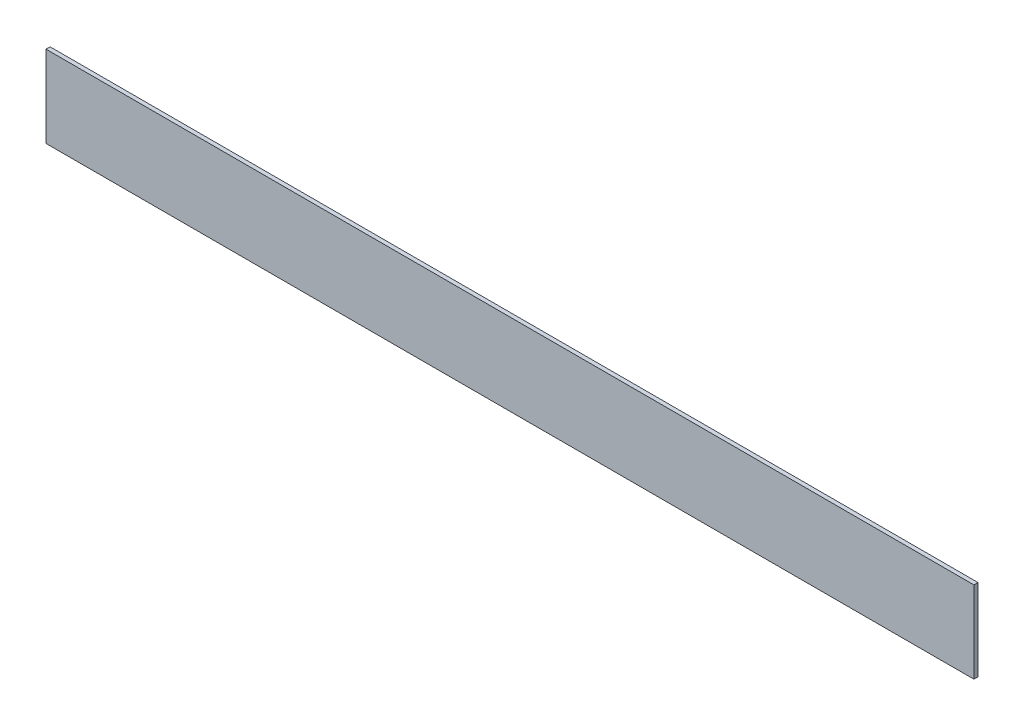
ISO-10303-21;
HEADER;
FILE_DESCRIPTION(('STEP AP214'),'2;1');
FILE_NAME('part.step','',(''),(''),'','','');
FILE_SCHEMA(('AUTOMOTIVE_DESIGN { 1 0 10303 214 1 1 1 1 }'));
ENDSEC;
DATA;
#1=APPLICATION_CONTEXT('core data for automotive mechanical design processes');
#2=APPLICATION_PROTOCOL_DEFINITION('international standard','automotive_design',2000,#1);
#3=PRODUCT_CONTEXT('',#1,'mechanical');
#4=PRODUCT('Part','Part','',(#3));
#5=PRODUCT_RELATED_PRODUCT_CATEGORY('part','',(#4));
#6=PRODUCT_DEFINITION_FORMATION('','',#4);
#7=PRODUCT_DEFINITION_CONTEXT('part definition',#1,'design');
#8=PRODUCT_DEFINITION('design','',#6,#7);
#9=PRODUCT_DEFINITION_SHAPE('','',#8);
#10=(LENGTH_UNIT() NAMED_UNIT(*) SI_UNIT(.MILLI.,.METRE.));
#11=(NAMED_UNIT(*) PLANE_ANGLE_UNIT() SI_UNIT($,.RADIAN.));
#12=(NAMED_UNIT(*) SI_UNIT($,.STERADIAN.) SOLID_ANGLE_UNIT());
#13=UNCERTAINTY_MEASURE_WITH_UNIT(LENGTH_MEASURE(1.E-05),#10,'distance_accuracy_value','');
#14=(GEOMETRIC_REPRESENTATION_CONTEXT(3) GLOBAL_UNCERTAINTY_ASSIGNED_CONTEXT((#13)) GLOBAL_UNIT_ASSIGNED_CONTEXT((#10,
#11,#12)) REPRESENTATION_CONTEXT('',''));
#15=CARTESIAN_POINT('',(0.,0.,0.));
#16=DIRECTION('',(0.,0.,1.));
#17=DIRECTION('',(1.,0.,0.));
#18=AXIS2_PLACEMENT_3D('',#15,#16,#17);
#19=CARTESIAN_POINT('',(-1135.875,99.9999999999999,10.));
#20=DIRECTION('',(1.,0.,0.));
#21=DIRECTION('',(0.,0.,-1.));
#22=AXIS2_PLACEMENT_3D('',#19,#20,#21);
#23=PLANE('',#22);
#24=DIRECTION('',(0.,-1.,0.));
#25=VECTOR('',#24,1.);
#26=CARTESIAN_POINT('',(-1135.875,99.9999999999999,0.));
#27=LINE('',#26,#25);
#28=CARTESIAN_POINT('',(-1135.875,99.9999999999999,0.));
#29=VERTEX_POINT('',#28);
#30=CARTESIAN_POINT('',(-1135.875,-100.,0.));
#31=VERTEX_POINT('',#30);
#32=EDGE_CURVE('E95',#29,#31,#27,.T.);
#33=ORIENTED_EDGE('',*,*,#32,.T.);
#34=DIRECTION('',(0.,0.,-1.));
#35=VECTOR('',#34,1.);
#36=CARTESIAN_POINT('',(-1135.875,-100.,10.));
#37=LINE('',#36,#35);
#38=CARTESIAN_POINT('',(-1135.875,-100.,10.));
#39=VERTEX_POINT('',#38);
#40=EDGE_CURVE('E11',#39,#31,#37,.T.);
#41=ORIENTED_EDGE('',*,*,#40,.F.);
#42=DIRECTION('',(0.,-1.,0.));
#43=VECTOR('',#42,1.);
#44=CARTESIAN_POINT('',(-1135.875,99.9999999999999,10.));
#45=LINE('',#44,#43);
#46=CARTESIAN_POINT('',(-1135.875,99.9999999999999,10.));
#47=VERTEX_POINT('',#46);
#48=EDGE_CURVE('E83',#47,#39,#45,.T.);
#49=ORIENTED_EDGE('',*,*,#48,.F.);
#50=DIRECTION('',(0.,0.,-1.));
#51=VECTOR('',#50,1.);
#52=CARTESIAN_POINT('',(-1135.875,99.9999999999999,10.));
#53=LINE('',#52,#51);
#54=EDGE_CURVE('E91',#47,#29,#53,.T.);
#55=ORIENTED_EDGE('',*,*,#54,.T.);
#56=EDGE_LOOP('',(#33,#41,#49,#55));
#57=FACE_BOUND('',#56,.T.);
#58=ADVANCED_FACE('F32',(#57),#23,.F.);
#59=CARTESIAN_POINT('',(1135.875,-99.9999999999999,10.));
#60=DIRECTION('',(0.,1.,0.));
#61=DIRECTION('',(-1.,0.,0.));
#62=AXIS2_PLACEMENT_3D('',#59,#60,#61);
#63=PLANE('',#62);
#64=DIRECTION('',(1.,0.,0.));
#65=VECTOR('',#64,1.);
#66=CARTESIAN_POINT('',(1135.875,-99.9999999999999,0.));
#67=LINE('',#66,#65);
#68=CARTESIAN_POINT('',(1135.875,-99.9999999999999,0.));
#69=VERTEX_POINT('',#68);
#70=EDGE_CURVE('E87',#31,#69,#67,.T.);
#71=ORIENTED_EDGE('',*,*,#70,.T.);
#72=DIRECTION('',(0.,0.,-1.));
#73=VECTOR('',#72,1.);
#74=CARTESIAN_POINT('',(1135.875,-99.9999999999999,10.));
#75=LINE('',#74,#73);
#76=CARTESIAN_POINT('',(1135.875,-99.9999999999999,10.));
#77=VERTEX_POINT('',#76);
#78=EDGE_CURVE('E40',#77,#69,#75,.T.);
#79=ORIENTED_EDGE('',*,*,#78,.F.);
#80=DIRECTION('',(1.,0.,0.));
#81=VECTOR('',#80,1.);
#82=CARTESIAN_POINT('',(1135.875,-99.9999999999999,10.));
#83=LINE('',#82,#81);
#84=EDGE_CURVE('E78',#39,#77,#83,.T.);
#85=ORIENTED_EDGE('',*,*,#84,.F.);
#86=ORIENTED_EDGE('',*,*,#40,.T.);
#87=EDGE_LOOP('',(#71,#79,#85,#86));
#88=FACE_BOUND('',#87,.T.);
#89=ADVANCED_FACE('F86',(#88),#63,.F.);
#90=CARTESIAN_POINT('',(1135.875,100.,10.));
#91=DIRECTION('',(-1.,0.,0.));
#92=DIRECTION('',(0.,0.,1.));
#93=AXIS2_PLACEMENT_3D('',#90,#91,#92);
#94=PLANE('',#93);
#95=DIRECTION('',(0.,1.,0.));
#96=VECTOR('',#95,1.);
#97=CARTESIAN_POINT('',(1135.875,100.,0.));
#98=LINE('',#97,#96);
#99=CARTESIAN_POINT('',(1135.875,100.,0.));
#100=VERTEX_POINT('',#99);
#101=EDGE_CURVE('E65',#69,#100,#98,.T.);
#102=ORIENTED_EDGE('',*,*,#101,.T.);
#103=DIRECTION('',(0.,0.,-1.));
#104=VECTOR('',#103,1.);
#105=CARTESIAN_POINT('',(1135.875,100.,10.));
#106=LINE('',#105,#104);
#107=CARTESIAN_POINT('',(1135.875,100.,10.));
#108=VERTEX_POINT('',#107);
#109=EDGE_CURVE('E88',#108,#100,#106,.T.);
#110=ORIENTED_EDGE('',*,*,#109,.F.);
#111=DIRECTION('',(0.,1.,0.));
#112=VECTOR('',#111,1.);
#113=CARTESIAN_POINT('',(1135.875,100.,10.));
#114=LINE('',#113,#112);
#115=EDGE_CURVE('E81',#77,#108,#114,.T.);
#116=ORIENTED_EDGE('',*,*,#115,.F.);
#117=ORIENTED_EDGE('',*,*,#78,.T.);
#118=EDGE_LOOP('',(#102,#110,#116,#117));
#119=FACE_BOUND('',#118,.T.);
#120=ADVANCED_FACE('F89',(#119),#94,.F.);
#121=CARTESIAN_POINT('',(1135.875,100.,10.));
#122=DIRECTION('',(0.,-1.,0.));
#123=DIRECTION('',(1.,0.,0.));
#124=AXIS2_PLACEMENT_3D('',#121,#122,#123);
#125=PLANE('',#124);
#126=DIRECTION('',(-1.,0.,0.));
#127=VECTOR('',#126,1.);
#128=CARTESIAN_POINT('',(1135.875,100.,0.));
#129=LINE('',#128,#127);
#130=EDGE_CURVE('E71',#100,#29,#129,.T.);
#131=ORIENTED_EDGE('',*,*,#130,.T.);
#132=ORIENTED_EDGE('',*,*,#54,.F.);
#133=DIRECTION('',(-1.,0.,0.));
#134=VECTOR('',#133,1.);
#135=CARTESIAN_POINT('',(1135.875,100.,10.));
#136=LINE('',#135,#134);
#137=EDGE_CURVE('E48',#108,#47,#136,.T.);
#138=ORIENTED_EDGE('',*,*,#137,.F.);
#139=ORIENTED_EDGE('',*,*,#109,.T.);
#140=EDGE_LOOP('',(#131,#132,#138,#139));
#141=FACE_BOUND('',#140,.T.);
#142=ADVANCED_FACE('F102',(#141),#125,.F.);
#143=CARTESIAN_POINT('',(0.,0.,10.));
#144=DIRECTION('',(0.,0.,-1.));
#145=DIRECTION('',(-1.,0.,0.));
#146=AXIS2_PLACEMENT_3D('',#143,#144,#145);
#147=PLANE('',#146);
#148=ORIENTED_EDGE('',*,*,#48,.T.);
#149=ORIENTED_EDGE('',*,*,#84,.T.);
#150=ORIENTED_EDGE('',*,*,#115,.T.);
#151=ORIENTED_EDGE('',*,*,#137,.T.);
#152=EDGE_LOOP('',(#148,#149,#150,#151));
#153=FACE_BOUND('',#152,.T.);
#154=ADVANCED_FACE('F79',(#153),#147,.F.);
#155=CARTESIAN_POINT('',(0.,0.,0.));
#156=DIRECTION('',(0.,0.,-1.));
#157=DIRECTION('',(-1.,0.,0.));
#158=AXIS2_PLACEMENT_3D('',#155,#156,#157);
#159=PLANE('',#158);
#160=ORIENTED_EDGE('',*,*,#32,.F.);
#161=ORIENTED_EDGE('',*,*,#130,.F.);
#162=ORIENTED_EDGE('',*,*,#101,.F.);
#163=ORIENTED_EDGE('',*,*,#70,.F.);
#164=EDGE_LOOP('',(#160,#161,#162,#163));
#165=FACE_BOUND('',#164,.T.);
#166=ADVANCED_FACE('F105',(#165),#159,.T.);
#167=CLOSED_SHELL('',(#58,#89,#120,#142,#154,#166));
#168=MANIFOLD_SOLID_BREP('B2',#167);
#169=ADVANCED_BREP_SHAPE_REPRESENTATION('',(#18,#168),#14);
#170=SHAPE_DEFINITION_REPRESENTATION(#9,#169);
ENDSEC;
END-ISO-10303-21;
